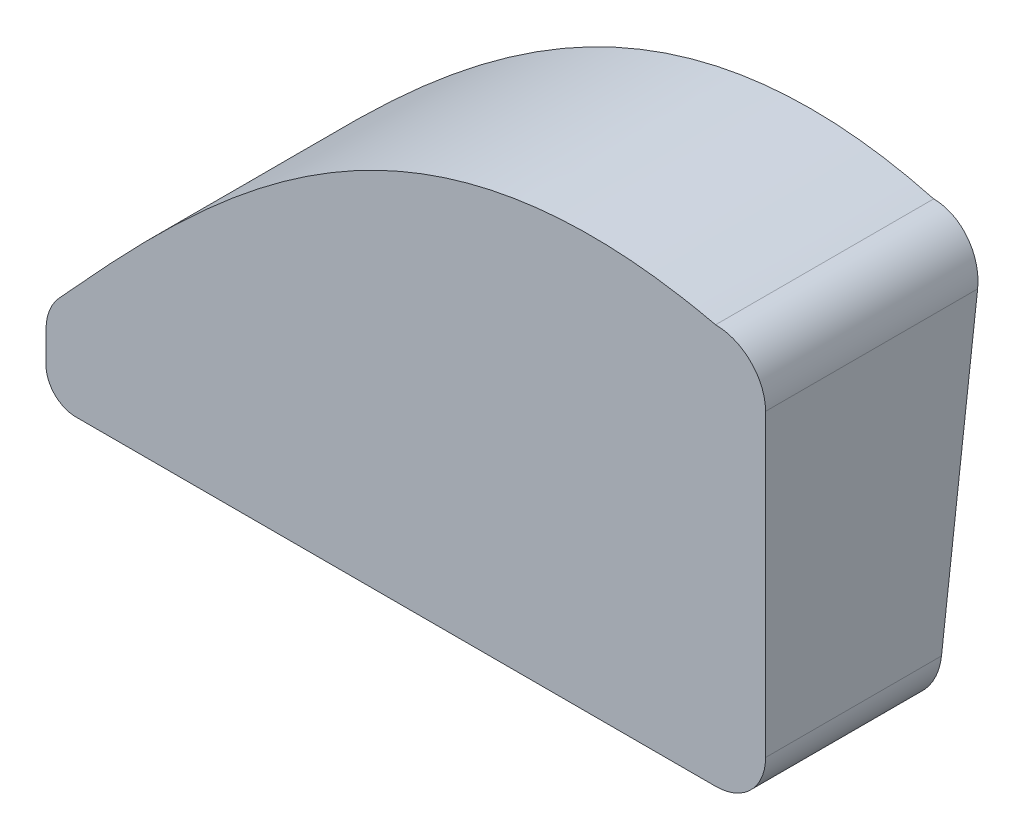
ISO-10303-21;
HEADER;
FILE_DESCRIPTION(('STEP AP214'),'2;1');
FILE_NAME('part.step','',(''),(''),'','','');
FILE_SCHEMA(('AUTOMOTIVE_DESIGN { 1 0 10303 214 1 1 1 1 }'));
ENDSEC;
DATA;
#1=APPLICATION_CONTEXT('core data for automotive mechanical design processes');
#2=APPLICATION_PROTOCOL_DEFINITION('international standard','automotive_design',2000,#1);
#3=PRODUCT_CONTEXT('',#1,'mechanical');
#4=PRODUCT('Part','Part','',(#3));
#5=PRODUCT_RELATED_PRODUCT_CATEGORY('part','',(#4));
#6=PRODUCT_DEFINITION_FORMATION('','',#4);
#7=PRODUCT_DEFINITION_CONTEXT('part definition',#1,'design');
#8=PRODUCT_DEFINITION('design','',#6,#7);
#9=PRODUCT_DEFINITION_SHAPE('','',#8);
#10=(LENGTH_UNIT() NAMED_UNIT(*) SI_UNIT(.MILLI.,.METRE.));
#11=(NAMED_UNIT(*) PLANE_ANGLE_UNIT() SI_UNIT($,.RADIAN.));
#12=(NAMED_UNIT(*) SI_UNIT($,.STERADIAN.) SOLID_ANGLE_UNIT());
#13=UNCERTAINTY_MEASURE_WITH_UNIT(LENGTH_MEASURE(1.E-05),#10,'distance_accuracy_value','');
#14=(GEOMETRIC_REPRESENTATION_CONTEXT(3) GLOBAL_UNCERTAINTY_ASSIGNED_CONTEXT((#13)) GLOBAL_UNIT_ASSIGNED_CONTEXT((#10,
#11,#12)) REPRESENTATION_CONTEXT('',''));
#15=CARTESIAN_POINT('',(0.,0.,0.));
#16=DIRECTION('',(0.,0.,1.));
#17=DIRECTION('',(1.,0.,0.));
#18=AXIS2_PLACEMENT_3D('',#15,#16,#17);
#19=CARTESIAN_POINT('',(54.3030303030303,17.5989547529279,22.));
#20=DIRECTION('',(1.,0.,0.));
#21=DIRECTION('',(0.,1.,0.));
#22=AXIS2_PLACEMENT_3D('',#19,#20,#21);
#23=PLANE('',#22);
#24=DIRECTION('',(0.,0.,-1.));
#25=VECTOR('',#24,1.);
#26=CARTESIAN_POINT('',(54.3030303030303,-12.3966812032091,22.));
#27=LINE('',#26,#25);
#28=CARTESIAN_POINT('',(54.3030303030303,-12.3966812032091,22.));
#29=VERTEX_POINT('',#28);
#30=CARTESIAN_POINT('',(54.3030303030303,-12.3966812032091,4.39736203257575));
#31=VERTEX_POINT('',#30);
#32=EDGE_CURVE('E42',#29,#31,#27,.T.);
#33=ORIENTED_EDGE('',*,*,#32,.T.);
#34=DIRECTION('',(0.,0.99281474018445,-0.119661571410718));
#35=VECTOR('',#34,1.);
#36=CARTESIAN_POINT('',(54.3030303030303,15.078225909849,1.08587759701909));
#37=LINE('',#36,#35);
#38=CARTESIAN_POINT('',(54.3030303030303,17.5989547529279,0.782060215734952));
#39=VERTEX_POINT('',#38);
#40=EDGE_CURVE('E56',#31,#39,#37,.T.);
#41=ORIENTED_EDGE('',*,*,#40,.T.);
#42=DIRECTION('',(0.,0.,-1.));
#43=VECTOR('',#42,1.);
#44=CARTESIAN_POINT('',(54.3030303030303,17.5989547529279,22.));
#45=LINE('',#44,#43);
#46=CARTESIAN_POINT('',(54.3030303030303,17.5989547529279,22.));
#47=VERTEX_POINT('',#46);
#48=EDGE_CURVE('E11',#47,#39,#45,.T.);
#49=ORIENTED_EDGE('',*,*,#48,.F.);
#50=DIRECTION('',(0.,-1.,0.));
#51=VECTOR('',#50,1.);
#52=CARTESIAN_POINT('',(54.3030303030303,17.5989547529279,22.));
#53=LINE('',#52,#51);
#54=EDGE_CURVE('E176',#47,#29,#53,.T.);
#55=ORIENTED_EDGE('',*,*,#54,.T.);
#56=EDGE_LOOP('',(#33,#41,#49,#55));
#57=FACE_BOUND('',#56,.T.);
#58=ADVANCED_FACE('F39',(#57),#23,.T.);
#59=CARTESIAN_POINT('',(49.3030303030303,17.5989547529279,22.));
#60=DIRECTION('',(0.,0.,-1.));
#61=DIRECTION('',(-1.,0.,0.));
#62=AXIS2_PLACEMENT_3D('',#59,#60,#61);
#63=CYLINDRICAL_SURFACE('',#62,5.);
#64=CARTESIAN_POINT('',(49.3030303030303,17.5989547529279,0.782060215734948));
#65=DIRECTION('',(0.,-0.119661571410718,-0.99281474018445));
#66=DIRECTION('',(0.,0.99281474018445,-0.119661571410718));
#67=AXIS2_PLACEMENT_3D('',#64,#65,#66);
#68=ELLIPSE('',#67,5.036186307096,5.);
#69=CARTESIAN_POINT('',(49.3030303030303,22.5989547529279,0.179422248310704));
#70=VERTEX_POINT('',#69);
#71=EDGE_CURVE('E62',#70,#39,#68,.T.);
#72=ORIENTED_EDGE('',*,*,#71,.F.);
#73=DIRECTION('',(0.,0.,-1.));
#74=VECTOR('',#73,1.);
#75=CARTESIAN_POINT('',(49.3030303030303,22.5989547529279,22.));
#76=LINE('',#75,#74);
#77=CARTESIAN_POINT('',(49.3030303030303,22.5989547529279,22.));
#78=VERTEX_POINT('',#77);
#79=EDGE_CURVE('E48',#78,#70,#76,.T.);
#80=ORIENTED_EDGE('',*,*,#79,.F.);
#81=CARTESIAN_POINT('',(49.3030303030303,17.5989547529279,22.));
#82=DIRECTION('',(0.,0.,1.));
#83=DIRECTION('',(1.,0.,0.));
#84=AXIS2_PLACEMENT_3D('',#81,#82,#83);
#85=CIRCLE('',#84,5.);
#86=EDGE_CURVE('E178',#47,#78,#85,.T.);
#87=ORIENTED_EDGE('',*,*,#86,.F.);
#88=ORIENTED_EDGE('',*,*,#48,.T.);
#89=EDGE_LOOP('',(#72,#80,#87,#88));
#90=FACE_BOUND('',#89,.T.);
#91=ADVANCED_FACE('F164',(#90),#63,.T.);
#92=CARTESIAN_POINT('',(-16.3915471002255,-7.93918414164526,22.));
#93=CARTESIAN_POINT('',(-0.135926549015394,9.90151172230741,22.));
#94=CARTESIAN_POINT('',(18.696906390298,29.7257373747822,22.));
#95=CARTESIAN_POINT('',(49.3030303030303,22.5989547529279,22.));
#96=B_SPLINE_CURVE_WITH_KNOTS('',3,(#92,#93,#94,#95),.UNSPECIFIED.,.F.,.F.,(4,4),
(0.0262995470463997,1.),.UNSPECIFIED.);
#97=DIRECTION('',(0.,0.,-1.));
#98=VECTOR('',#97,1.);
#99=SURFACE_OF_LINEAR_EXTRUSION('',#96,#98);
#100=ORIENTED_EDGE('',*,*,#79,.T.);
#101=CARTESIAN_POINT('',(49.3030303030303,22.5989547529279,0.179422248310704));
#102=CARTESIAN_POINT('',(48.7502562966403,22.727674069721,0.16390801882262));
#103=CARTESIAN_POINT('',(48.1956935191239,22.8489065228533,0.149296162994315));
#104=CARTESIAN_POINT('',(47.0827212262123,23.0758162036586,0.121947285228434));
#105=CARTESIAN_POINT('',(46.5243081744895,23.1814763185473,0.109212325853569));
#106=CARTESIAN_POINT('',(45.4042144840436,23.3764384054658,0.0857140146964932));
#107=CARTESIAN_POINT('',(44.8425319791307,23.465729841351,0.0749519328104493));
#108=CARTESIAN_POINT('',(43.7165023437948,23.6272034950568,0.0554899019180774));
#109=CARTESIAN_POINT('',(43.1521544749768,23.6993806489789,0.0467905632512651));
#110=CARTESIAN_POINT('',(42.0214026465682,23.8259311241138,0.0315377390288938));
#111=CARTESIAN_POINT('',(41.4549985874446,23.8803035715225,0.0249843587908465));
#112=CARTESIAN_POINT('',(40.3216424710989,23.9705431844732,0.0141079954048895));
#113=CARTESIAN_POINT('',(39.7546929061054,24.0064410828715,0.00978130809978164));
#114=CARTESIAN_POINT('',(38.6200267174648,24.0593010542858,0.00341022295353221));
#115=CARTESIAN_POINT('',(38.052310305522,24.076267577724,0.00136528871372377));
#116=CARTESIAN_POINT('',(36.916752297897,24.0907897433076,-0.000385032956256923));
#117=CARTESIAN_POINT('',(36.3489107614107,24.0883498676903,-9.09606197022314E-05));
#118=CARTESIAN_POINT('',(35.2137410340238,24.063669629768,0.00288368906371447));
#119=CARTESIAN_POINT('',(34.6464127802545,24.0414321597805,0.00556391780649184));
#120=CARTESIAN_POINT('',(33.512919854661,23.976862144714,0.0133463863337309));
#121=CARTESIAN_POINT('',(32.9467551866918,23.9345295331658,0.018448634129568));
#122=CARTESIAN_POINT('',(31.6699384431578,23.8159825796641,0.0327368131500763));
#123=CARTESIAN_POINT('',(30.9598363858026,23.7338331167062,0.0426380902264801));
#124=CARTESIAN_POINT('',(29.5440465386091,23.5372486702371,0.0663319404759604));
#125=CARTESIAN_POINT('',(28.838359650085,23.4228073011883,0.0801252832825108));
#126=CARTESIAN_POINT('',(27.4329817707585,23.1618549859049,0.111577237857926));
#127=CARTESIAN_POINT('',(26.7332911442797,23.0153421052099,0.129236082782628));
#128=CARTESIAN_POINT('',(25.3414423521239,22.6908015040238,0.168352180431707));
#129=CARTESIAN_POINT('',(24.6492834660312,22.5127768262885,0.189809066420068));
#130=CARTESIAN_POINT('',(23.2753426794687,22.1264921430528,0.236367029690525));
#131=CARTESIAN_POINT('',(22.5935402407182,21.9183040638917,0.261459437864041));
#132=CARTESIAN_POINT('',(21.2398010766469,21.4724821376946,0.315193281751355));
#133=CARTESIAN_POINT('',(20.5678641684284,21.2348488373188,0.343834651577519));
#134=CARTESIAN_POINT('',(19.2347353696738,20.7314303675914,0.404510468249579));
#135=CARTESIAN_POINT('',(18.5735442200628,20.4656432664409,0.436545147930568));
#136=CARTESIAN_POINT('',(17.2627192425052,19.907434999063,0.503824647060977));
#137=CARTESIAN_POINT('',(16.6130851197042,19.6150145135009,0.539069384471445));
#138=CARTESIAN_POINT('',(15.1108258013286,18.9032400144072,0.624857851951097));
#139=CARTESIAN_POINT('',(14.2628852667179,18.4741153408288,0.676579216162465));
#140=CARTESIAN_POINT('',(12.5889917214329,17.5752103212085,0.784922074948752));
#141=CARTESIAN_POINT('',(11.7630439848626,17.105420335993,0.841544731310065));
#142=CARTESIAN_POINT('',(10.1331168233974,16.129151089689,0.959212114160351));
#143=CARTESIAN_POINT('',(9.3291450160767,15.622659323219,1.02025834789287));
#144=CARTESIAN_POINT('',(7.74309345871204,14.5771257510876,1.14627399324948));
#145=CARTESIAN_POINT('',(6.9610125504577,14.0380856722847,1.21124319673948));
#146=CARTESIAN_POINT('',(5.41171244264686,12.9267924915215,1.345184689473));
#147=CARTESIAN_POINT('',(4.64466140248656,12.3543088922633,1.41418476000113));
#148=CARTESIAN_POINT('',(3.13094468624023,11.1838589137919,1.55525627920068));
#149=CARTESIAN_POINT('',(2.38427332919489,10.585899757565,1.62732685730293));
#150=CARTESIAN_POINT('',(0.909682081992755,9.36769341627887,1.77415433598614));
#151=CARTESIAN_POINT('',(0.181761792727855,8.74744670627428,1.84891117930989));
#152=CARTESIAN_POINT('',(-1.25687884301039,7.48776876388396,2.00073713027214));
#153=CARTESIAN_POINT('',(-1.96760073456889,6.84833926650544,2.0778060287944));
#154=CARTESIAN_POINT('',(-3.48337361965605,5.45195609070207,2.24610873255671));
#155=CARTESIAN_POINT('',(-4.28583475834453,4.69223563065744,2.33767601132709));
#156=CARTESIAN_POINT('',(-5.87295497026198,3.15482296828671,2.52297665971577));
#157=CARTESIAN_POINT('',(-6.65761498081595,2.37713171659236,2.61670991475671));
#158=CARTESIAN_POINT('',(-8.21223926386949,0.807244739964274,2.8059246140929));
#159=CARTESIAN_POINT('',(-8.98220163789361,0.0150471668158768,2.90140628114901));
#160=CARTESIAN_POINT('',(-10.4972129025324,-1.5666153202267,3.09204025441752));
#161=CARTESIAN_POINT('',(-11.2424624171822,-2.35589132367553,3.18716979170854));
#162=CARTESIAN_POINT('',(-12.7245556980748,-3.94193910966451,3.37833231450577));
#163=CARTESIAN_POINT('',(-13.4614007094858,-4.73870974906399,3.47436516223197));
#164=CARTESIAN_POINT('',(-14.9296528942015,-6.33645200380376,3.66693719120481));
#165=CARTESIAN_POINT('',(-15.6610625981376,-7.13742132379594,3.76347609579867));
#166=CARTESIAN_POINT('',(-16.3915471002255,-7.93918414164526,3.86011063877968));
#167=B_SPLINE_CURVE_WITH_KNOTS('',3,(#101,#102,#103,#104,#105,#106,#107,#108,#109,#110,#111,
#112,#113,#114,#115,#116,#117,#118,#119,#120,#121,#122,#123,#124,#125,#126,#127,#128,#129,#130,
#131,#132,#133,#134,#135,#136,#137,#138,#139,#140,#141,#142,#143,#144,#145,#146,#147,#148,#149,
#150,#151,#152,#153,#154,#155,#156,#157,#158,#159,#160,#161,#162,#163,#164,#165,#166),
.UNSPECIFIED.,.F.,.F.,(4,2,2,2,2,2,2,2,2,2,2,2,2,2,2,2,2,2,2,2,2,2,2,2,2,2,2,2,2,2,2,2,4),(0.,
1.70330109422131,3.40846024581249,5.11471314478556,6.82147027407463,8.52831115358044,
10.2323034089443,11.9358950022544,13.6390931335957,15.3420424780557,17.0449974554447,
19.1889418134228,21.3333104214538,23.4778084072154,25.6220994346961,27.7613589572834,
29.9005787697658,32.0399454619919,34.1792574940857,37.0332210188016,39.8878629000504,
42.7434820576674,45.5989498426299,48.4771791637327,51.3545977927193,54.2319551264443,
57.1090529945695,60.4351827801126,63.7611370186393,67.0875179985389,70.3564755801903,
73.6249423890749,76.8917777983569),.UNSPECIFIED.);
#168=CARTESIAN_POINT('',(36.8494738568547,24.0875951805928,0.));
#169=VERTEX_POINT('',#168);
#170=EDGE_CURVE('E141',#70,#169,#167,.T.);
#171=ORIENTED_EDGE('',*,*,#170,.T.);
#172=CARTESIAN_POINT('',(-16.3915471002255,-7.93918414164526,0.));
#173=CARTESIAN_POINT('',(-0.135926549015394,9.90151172230741,0.));
#174=CARTESIAN_POINT('',(18.696906390298,29.7257373747822,0.));
#175=CARTESIAN_POINT('',(49.3030303030303,22.5989547529279,0.));
#176=B_SPLINE_CURVE_WITH_KNOTS('',3,(#172,#173,#174,#175),.UNSPECIFIED.,.F.,.F.,(4,4),
(0.0262995470463997,1.),.UNSPECIFIED.);
#177=CARTESIAN_POINT('',(36.8494495897905,24.0875951805868,0.));
#178=VERTEX_POINT('',#177);
#179=EDGE_CURVE('E192',#178,#169,#176,.T.);
#180=ORIENTED_EDGE('',*,*,#179,.F.);
#181=CARTESIAN_POINT('',(-16.3915471002255,-7.93918414164526,3.86011063877968));
#182=VERTEX_POINT('',#181);
#183=EDGE_CURVE('E151',#178,#182,#167,.T.);
#184=ORIENTED_EDGE('',*,*,#183,.T.);
#185=DIRECTION('',(0.,0.,-1.));
#186=VECTOR('',#185,1.);
#187=CARTESIAN_POINT('',(-16.3915471002255,-7.93918414164526,22.));
#188=LINE('',#187,#186);
#189=CARTESIAN_POINT('',(-16.3915471002255,-7.93918414164526,22.));
#190=VERTEX_POINT('',#189);
#191=EDGE_CURVE('E203',#190,#182,#188,.T.);
#192=ORIENTED_EDGE('',*,*,#191,.F.);
#193=EDGE_CURVE('E180',#190,#78,#96,.T.);
#194=ORIENTED_EDGE('',*,*,#193,.T.);
#195=EDGE_LOOP('',(#100,#171,#180,#184,#192,#194));
#196=FACE_BOUND('',#195,.T.);
#197=ADVANCED_FACE('F153',(#196),#99,.T.);
#198=CARTESIAN_POINT('',(-12.6956442418128,-11.3067206390238,22.));
#199=DIRECTION('',(0.,0.,-1.));
#200=DIRECTION('',(-1.,0.,0.));
#201=AXIS2_PLACEMENT_3D('',#198,#199,#200);
#202=CYLINDRICAL_SURFACE('',#201,5.);
#203=ORIENTED_EDGE('',*,*,#191,.T.);
#204=CARTESIAN_POINT('',(-12.6956442418128,-11.3067206390238,4.26599170878111));
#205=DIRECTION('',(0.,-0.119661571410718,-0.99281474018445));
#206=DIRECTION('',(0.,0.99281474018445,-0.119661571410718));
#207=AXIS2_PLACEMENT_3D('',#204,#205,#206);
#208=ELLIPSE('',#207,5.036186307096,5.);
#209=CARTESIAN_POINT('',(-17.6956442418128,-11.3067206390238,4.26599170878111));
#210=VERTEX_POINT('',#209);
#211=EDGE_CURVE('E229',#182,#210,#208,.F.);
#212=ORIENTED_EDGE('',*,*,#211,.T.);
#213=DIRECTION('',(0.,0.,-1.));
#214=VECTOR('',#213,1.);
#215=CARTESIAN_POINT('',(-17.6956442418128,-11.3067206390238,22.));
#216=LINE('',#215,#214);
#217=CARTESIAN_POINT('',(-17.6956442418128,-11.3067206390238,22.));
#218=VERTEX_POINT('',#217);
#219=EDGE_CURVE('E207',#218,#210,#216,.T.);
#220=ORIENTED_EDGE('',*,*,#219,.F.);
#221=CARTESIAN_POINT('',(-12.6956442418128,-11.3067206390238,22.));
#222=DIRECTION('',(0.,0.,-1.));
#223=DIRECTION('',(-1.,0.,0.));
#224=AXIS2_PLACEMENT_3D('',#221,#222,#223);
#225=CIRCLE('',#224,5.);
#226=EDGE_CURVE('E186',#218,#190,#225,.T.);
#227=ORIENTED_EDGE('',*,*,#226,.T.);
#228=EDGE_LOOP('',(#203,#212,#220,#227));
#229=FACE_BOUND('',#228,.T.);
#230=ADVANCED_FACE('F170',(#229),#202,.T.);
#231=CARTESIAN_POINT('',(-17.6956442418128,-11.3067206390238,22.));
#232=DIRECTION('',(1.,0.,0.));
#233=DIRECTION('',(0.,1.,0.));
#234=AXIS2_PLACEMENT_3D('',#231,#232,#233);
#235=PLANE('',#234);
#236=DIRECTION('',(0.,0.99281474018445,-0.119661571410718));
#237=VECTOR('',#236,1.);
#238=CARTESIAN_POINT('',(-17.6956442418128,-13.4135522474454,4.51992305242197));
#239=LINE('',#238,#237);
#240=CARTESIAN_POINT('',(-17.6956442418128,-14.3966812032091,4.63841721954545));
#241=VERTEX_POINT('',#240);
#242=EDGE_CURVE('E226',#241,#210,#239,.T.);
#243=ORIENTED_EDGE('',*,*,#242,.F.);
#244=DIRECTION('',(0.,0.,-1.));
#245=VECTOR('',#244,1.);
#246=CARTESIAN_POINT('',(-17.6956442418128,-14.3966812032091,22.));
#247=LINE('',#246,#245);
#248=CARTESIAN_POINT('',(-17.6956442418128,-14.3966812032091,22.));
#249=VERTEX_POINT('',#248);
#250=EDGE_CURVE('E211',#249,#241,#247,.T.);
#251=ORIENTED_EDGE('',*,*,#250,.F.);
#252=DIRECTION('',(0.,-1.,0.));
#253=VECTOR('',#252,1.);
#254=CARTESIAN_POINT('',(-17.6956442418128,-11.3067206390238,22.));
#255=LINE('',#254,#253);
#256=EDGE_CURVE('E242',#218,#249,#255,.T.);
#257=ORIENTED_EDGE('',*,*,#256,.F.);
#258=ORIENTED_EDGE('',*,*,#219,.T.);
#259=EDGE_LOOP('',(#243,#251,#257,#258));
#260=FACE_BOUND('',#259,.T.);
#261=ADVANCED_FACE('F250',(#260),#235,.F.);
#262=CARTESIAN_POINT('',(-14.6956442418128,-14.3966812032091,22.));
#263=DIRECTION('',(0.,0.,-1.));
#264=DIRECTION('',(-1.,0.,0.));
#265=AXIS2_PLACEMENT_3D('',#262,#263,#264);
#266=CYLINDRICAL_SURFACE('',#265,3.);
#267=ORIENTED_EDGE('',*,*,#250,.T.);
#268=CARTESIAN_POINT('',(-14.6956442418128,-14.3966812032091,4.63841721954545));
#269=DIRECTION('',(0.,-0.119661571410718,-0.99281474018445));
#270=DIRECTION('',(0.,0.99281474018445,-0.119661571410718));
#271=AXIS2_PLACEMENT_3D('',#268,#269,#270);
#272=ELLIPSE('',#271,3.0217117842576,3.);
#273=CARTESIAN_POINT('',(-14.6956442418127,-17.3966812032091,5.));
#274=VERTEX_POINT('',#273);
#275=EDGE_CURVE('E150',#241,#274,#272,.F.);
#276=ORIENTED_EDGE('',*,*,#275,.T.);
#277=DIRECTION('',(0.,0.,-1.));
#278=VECTOR('',#277,1.);
#279=CARTESIAN_POINT('',(-14.6956442418127,-17.3966812032091,22.));
#280=LINE('',#279,#278);
#281=CARTESIAN_POINT('',(-14.6956442418127,-17.3966812032091,22.));
#282=VERTEX_POINT('',#281);
#283=EDGE_CURVE('E123',#282,#274,#280,.T.);
#284=ORIENTED_EDGE('',*,*,#283,.F.);
#285=CARTESIAN_POINT('',(-14.6956442418128,-14.3966812032091,22.));
#286=DIRECTION('',(0.,0.,-1.));
#287=DIRECTION('',(-1.,0.,0.));
#288=AXIS2_PLACEMENT_3D('',#285,#286,#287);
#289=CIRCLE('',#288,3.);
#290=EDGE_CURVE('E221',#282,#249,#289,.T.);
#291=ORIENTED_EDGE('',*,*,#290,.T.);
#292=EDGE_LOOP('',(#267,#276,#284,#291));
#293=FACE_BOUND('',#292,.T.);
#294=ADVANCED_FACE('F219',(#293),#266,.T.);
#295=CARTESIAN_POINT('',(49.3030303030303,-17.3966812032091,22.));
#296=DIRECTION('',(0.,-1.,0.));
#297=DIRECTION('',(0.,0.,-1.));
#298=AXIS2_PLACEMENT_3D('',#295,#296,#297);
#299=PLANE('',#298);
#300=ORIENTED_EDGE('',*,*,#283,.T.);
#301=DIRECTION('',(-1.,0.,0.));
#302=VECTOR('',#301,1.);
#303=CARTESIAN_POINT('',(176.601471176903,-17.3966812032091,5.));
#304=LINE('',#303,#302);
#305=CARTESIAN_POINT('',(49.3030303030303,-17.3966812032091,5.));
#306=VERTEX_POINT('',#305);
#307=EDGE_CURVE('E126',#306,#274,#304,.T.);
#308=ORIENTED_EDGE('',*,*,#307,.F.);
#309=DIRECTION('',(0.,0.,-1.));
#310=VECTOR('',#309,1.);
#311=CARTESIAN_POINT('',(49.3030303030303,-17.3966812032091,22.));
#312=LINE('',#311,#310);
#313=CARTESIAN_POINT('',(49.3030303030303,-17.3966812032091,22.));
#314=VERTEX_POINT('',#313);
#315=EDGE_CURVE('E112',#314,#306,#312,.T.);
#316=ORIENTED_EDGE('',*,*,#315,.F.);
#317=DIRECTION('',(-1.,0.,0.));
#318=VECTOR('',#317,1.);
#319=CARTESIAN_POINT('',(49.3030303030303,-17.3966812032091,22.));
#320=LINE('',#319,#318);
#321=EDGE_CURVE('E237',#314,#282,#320,.T.);
#322=ORIENTED_EDGE('',*,*,#321,.T.);
#323=EDGE_LOOP('',(#300,#308,#316,#322));
#324=FACE_BOUND('',#323,.T.);
#325=ADVANCED_FACE('F127',(#324),#299,.T.);
#326=CARTESIAN_POINT('',(49.3030303030303,-12.3966812032091,22.));
#327=DIRECTION('',(0.,0.,-1.));
#328=DIRECTION('',(-1.,0.,0.));
#329=AXIS2_PLACEMENT_3D('',#326,#327,#328);
#330=CYLINDRICAL_SURFACE('',#329,4.99999999999999);
#331=CARTESIAN_POINT('',(49.3030303030303,-12.3966812032091,4.39736203257575));
#332=DIRECTION('',(0.,-0.119661571410718,-0.99281474018445));
#333=DIRECTION('',(0.,0.99281474018445,-0.119661571410718));
#334=AXIS2_PLACEMENT_3D('',#331,#332,#333);
#335=ELLIPSE('',#334,5.03618630709599,4.99999999999999);
#336=EDGE_CURVE('E117',#31,#306,#335,.T.);
#337=ORIENTED_EDGE('',*,*,#336,.F.);
#338=ORIENTED_EDGE('',*,*,#32,.F.);
#339=CARTESIAN_POINT('',(49.3030303030303,-12.3966812032091,22.));
#340=DIRECTION('',(0.,0.,1.));
#341=DIRECTION('',(1.,0.,0.));
#342=AXIS2_PLACEMENT_3D('',#339,#340,#341);
#343=CIRCLE('',#342,4.99999999999999);
#344=EDGE_CURVE('E118',#314,#29,#343,.T.);
#345=ORIENTED_EDGE('',*,*,#344,.F.);
#346=ORIENTED_EDGE('',*,*,#315,.T.);
#347=EDGE_LOOP('',(#337,#338,#345,#346));
#348=FACE_BOUND('',#347,.T.);
#349=ADVANCED_FACE('F114',(#348),#330,.T.);
#350=CARTESIAN_POINT('',(49.3030303030303,-12.3966812032091,22.));
#351=DIRECTION('',(0.,0.,1.));
#352=DIRECTION('',(1.,0.,0.));
#353=AXIS2_PLACEMENT_3D('',#350,#351,#352);
#354=PLANE('',#353);
#355=ORIENTED_EDGE('',*,*,#54,.F.);
#356=ORIENTED_EDGE('',*,*,#86,.T.);
#357=ORIENTED_EDGE('',*,*,#193,.F.);
#358=ORIENTED_EDGE('',*,*,#226,.F.);
#359=ORIENTED_EDGE('',*,*,#256,.T.);
#360=ORIENTED_EDGE('',*,*,#290,.F.);
#361=ORIENTED_EDGE('',*,*,#321,.F.);
#362=ORIENTED_EDGE('',*,*,#344,.T.);
#363=EDGE_LOOP('',(#355,#356,#357,#358,#359,#360,#361,#362));
#364=FACE_BOUND('',#363,.T.);
#365=ADVANCED_FACE('F161',(#364),#354,.T.);
#366=CARTESIAN_POINT('',(176.601471176903,24.0875951805928,0.));
#367=DIRECTION('',(0.,-0.119661571410718,-0.99281474018445));
#368=DIRECTION('',(0.,0.99281474018445,-0.119661571410718));
#369=AXIS2_PLACEMENT_3D('',#366,#367,#368);
#370=PLANE('',#369);
#371=ORIENTED_EDGE('',*,*,#183,.F.);
#372=ORIENTED_EDGE('',*,*,#179,.T.);
#373=ORIENTED_EDGE('',*,*,#170,.F.);
#374=ORIENTED_EDGE('',*,*,#71,.T.);
#375=ORIENTED_EDGE('',*,*,#40,.F.);
#376=ORIENTED_EDGE('',*,*,#336,.T.);
#377=ORIENTED_EDGE('',*,*,#307,.T.);
#378=ORIENTED_EDGE('',*,*,#275,.F.);
#379=ORIENTED_EDGE('',*,*,#242,.T.);
#380=ORIENTED_EDGE('',*,*,#211,.F.);
#381=EDGE_LOOP('',(#371,#372,#373,#374,#375,#376,#377,#378,#379,#380));
#382=FACE_BOUND('',#381,.T.);
#383=ADVANCED_FACE('F133',(#382),#370,.T.);
#384=CLOSED_SHELL('',(#58,#91,#197,#230,#261,#294,#325,#349,#365,#383));
#385=MANIFOLD_SOLID_BREP('B2',#384);
#386=ADVANCED_BREP_SHAPE_REPRESENTATION('',(#18,#385),#14);
#387=SHAPE_DEFINITION_REPRESENTATION(#9,#386);
ENDSEC;
END-ISO-10303-21;
